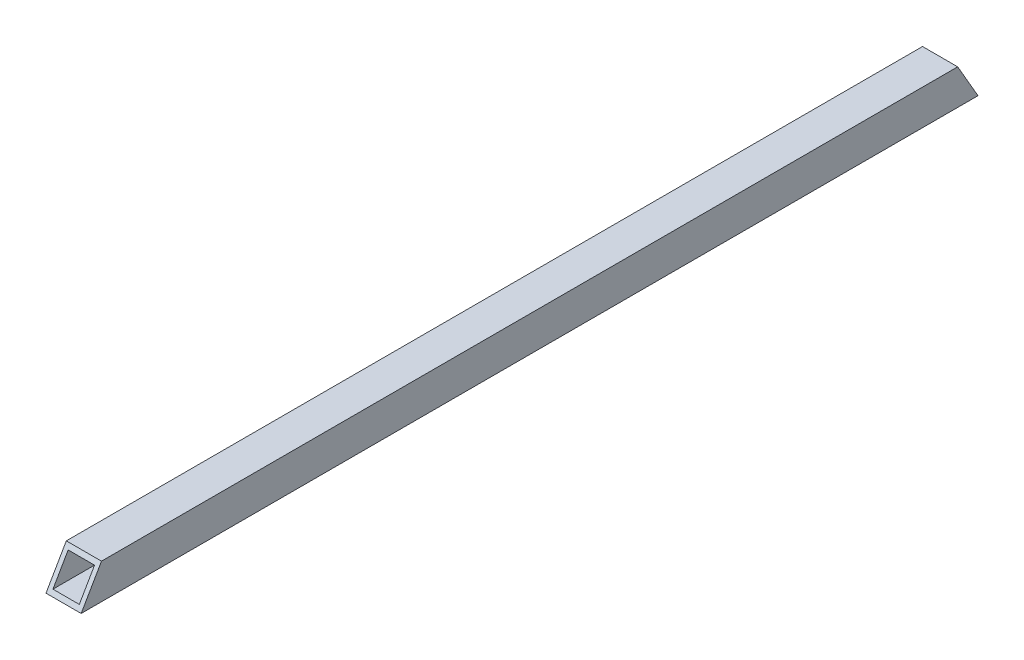
ISO-10303-21;
HEADER;
FILE_DESCRIPTION(('STEP AP214'),'2;1');
FILE_NAME('part.step','',(''),(''),'','','');
FILE_SCHEMA(('AUTOMOTIVE_DESIGN { 1 0 10303 214 1 1 1 1 }'));
ENDSEC;
DATA;
#1=APPLICATION_CONTEXT('core data for automotive mechanical design processes');
#2=APPLICATION_PROTOCOL_DEFINITION('international standard','automotive_design',2000,#1);
#3=PRODUCT_CONTEXT('',#1,'mechanical');
#4=PRODUCT('Part','Part','',(#3));
#5=PRODUCT_RELATED_PRODUCT_CATEGORY('part','',(#4));
#6=PRODUCT_DEFINITION_FORMATION('','',#4);
#7=PRODUCT_DEFINITION_CONTEXT('part definition',#1,'design');
#8=PRODUCT_DEFINITION('design','',#6,#7);
#9=PRODUCT_DEFINITION_SHAPE('','',#8);
#10=(LENGTH_UNIT() NAMED_UNIT(*) SI_UNIT(.MILLI.,.METRE.));
#11=(NAMED_UNIT(*) PLANE_ANGLE_UNIT() SI_UNIT($,.RADIAN.));
#12=(NAMED_UNIT(*) SI_UNIT($,.STERADIAN.) SOLID_ANGLE_UNIT());
#13=UNCERTAINTY_MEASURE_WITH_UNIT(LENGTH_MEASURE(1.E-05),#10,'distance_accuracy_value','');
#14=(GEOMETRIC_REPRESENTATION_CONTEXT(3) GLOBAL_UNCERTAINTY_ASSIGNED_CONTEXT((#13)) GLOBAL_UNIT_ASSIGNED_CONTEXT((#10,
#11,#12)) REPRESENTATION_CONTEXT('',''));
#15=CARTESIAN_POINT('',(0.,0.,0.));
#16=DIRECTION('',(0.,0.,1.));
#17=DIRECTION('',(1.,0.,0.));
#18=AXIS2_PLACEMENT_3D('',#15,#16,#17);
#19=CARTESIAN_POINT('',(-12.7,-12.7,323.85));
#20=DIRECTION('',(1.,0.,0.));
#21=DIRECTION('',(0.,0.,-1.));
#22=AXIS2_PLACEMENT_3D('',#19,#20,#21);
#23=PLANE('',#22);
#24=DIRECTION('',(0.,0.,-1.));
#25=VECTOR('',#24,1.);
#26=CARTESIAN_POINT('',(-12.7,12.7,323.85));
#27=LINE('',#26,#25);
#28=CARTESIAN_POINT('',(-12.7,12.7,309.185303162584));
#29=VERTEX_POINT('',#28);
#30=CARTESIAN_POINT('',(-12.7,12.7,-309.185303162584));
#31=VERTEX_POINT('',#30);
#32=EDGE_CURVE('E110',#29,#31,#27,.T.);
#33=ORIENTED_EDGE('',*,*,#32,.T.);
#34=DIRECTION('',(0.,-0.866025403784444,-0.49999999999999));
#35=VECTOR('',#34,1.);
#36=CARTESIAN_POINT('',(-12.7,-12.7,-323.85));
#37=LINE('',#36,#35);
#38=CARTESIAN_POINT('',(-12.7,-12.7,-323.85));
#39=VERTEX_POINT('',#38);
#40=EDGE_CURVE('E94',#31,#39,#37,.T.);
#41=ORIENTED_EDGE('',*,*,#40,.T.);
#42=DIRECTION('',(0.,0.,-1.));
#43=VECTOR('',#42,1.);
#44=CARTESIAN_POINT('',(-12.7,-12.7,323.85));
#45=LINE('',#44,#43);
#46=CARTESIAN_POINT('',(-12.7,-12.7,323.85));
#47=VERTEX_POINT('',#46);
#48=EDGE_CURVE('E39',#47,#39,#45,.T.);
#49=ORIENTED_EDGE('',*,*,#48,.F.);
#50=DIRECTION('',(0.,-0.866025403784444,0.49999999999999));
#51=VECTOR('',#50,1.);
#52=CARTESIAN_POINT('',(-12.7,-12.7,323.85));
#53=LINE('',#52,#51);
#54=EDGE_CURVE('E116',#29,#47,#53,.T.);
#55=ORIENTED_EDGE('',*,*,#54,.F.);
#56=EDGE_LOOP('',(#33,#41,#49,#55));
#57=FACE_BOUND('',#56,.T.);
#58=ADVANCED_FACE('F32',(#57),#23,.F.);
#59=CARTESIAN_POINT('',(12.7,-12.7,323.85));
#60=DIRECTION('',(0.,1.,0.));
#61=DIRECTION('',(-1.,0.,0.));
#62=AXIS2_PLACEMENT_3D('',#59,#60,#61);
#63=PLANE('',#62);
#64=ORIENTED_EDGE('',*,*,#48,.T.);
#65=DIRECTION('',(1.,0.,0.));
#66=VECTOR('',#65,1.);
#67=CARTESIAN_POINT('',(12.7,-12.7,-323.85));
#68=LINE('',#67,#66);
#69=CARTESIAN_POINT('',(12.7,-12.7,-323.85));
#70=VERTEX_POINT('',#69);
#71=EDGE_CURVE('E100',#39,#70,#68,.T.);
#72=ORIENTED_EDGE('',*,*,#71,.T.);
#73=DIRECTION('',(0.,0.,-1.));
#74=VECTOR('',#73,1.);
#75=CARTESIAN_POINT('',(12.7,-12.7,323.85));
#76=LINE('',#75,#74);
#77=CARTESIAN_POINT('',(12.7,-12.7,323.85));
#78=VERTEX_POINT('',#77);
#79=EDGE_CURVE('E119',#78,#70,#76,.T.);
#80=ORIENTED_EDGE('',*,*,#79,.F.);
#81=DIRECTION('',(1.,0.,0.));
#82=VECTOR('',#81,1.);
#83=CARTESIAN_POINT('',(12.7,-12.7,323.85));
#84=LINE('',#83,#82);
#85=EDGE_CURVE('E117',#47,#78,#84,.T.);
#86=ORIENTED_EDGE('',*,*,#85,.F.);
#87=EDGE_LOOP('',(#64,#72,#80,#86));
#88=FACE_BOUND('',#87,.T.);
#89=ADVANCED_FACE('F128',(#88),#63,.F.);
#90=CARTESIAN_POINT('',(12.7,-12.7,323.85));
#91=DIRECTION('',(-1.,0.,0.));
#92=DIRECTION('',(0.,0.,1.));
#93=AXIS2_PLACEMENT_3D('',#90,#91,#92);
#94=PLANE('',#93);
#95=ORIENTED_EDGE('',*,*,#79,.T.);
#96=DIRECTION('',(0.,0.866025403784444,0.49999999999999));
#97=VECTOR('',#96,1.);
#98=CARTESIAN_POINT('',(12.7,12.7,-309.185303162584));
#99=LINE('',#98,#97);
#100=CARTESIAN_POINT('',(12.7,12.7,-309.185303162584));
#101=VERTEX_POINT('',#100);
#102=EDGE_CURVE('E113',#70,#101,#99,.T.);
#103=ORIENTED_EDGE('',*,*,#102,.T.);
#104=DIRECTION('',(0.,0.,-1.));
#105=VECTOR('',#104,1.);
#106=CARTESIAN_POINT('',(12.7,12.7,323.85));
#107=LINE('',#106,#105);
#108=CARTESIAN_POINT('',(12.7,12.7,309.185303162584));
#109=VERTEX_POINT('',#108);
#110=EDGE_CURVE('E112',#109,#101,#107,.T.);
#111=ORIENTED_EDGE('',*,*,#110,.F.);
#112=DIRECTION('',(0.,0.866025403784444,-0.49999999999999));
#113=VECTOR('',#112,1.);
#114=CARTESIAN_POINT('',(12.7,12.7,309.185303162584));
#115=LINE('',#114,#113);
#116=EDGE_CURVE('E54',#78,#109,#115,.T.);
#117=ORIENTED_EDGE('',*,*,#116,.F.);
#118=EDGE_LOOP('',(#95,#103,#111,#117));
#119=FACE_BOUND('',#118,.T.);
#120=ADVANCED_FACE('F132',(#119),#94,.F.);
#121=CARTESIAN_POINT('',(12.7,12.7,323.85));
#122=DIRECTION('',(0.,-1.,0.));
#123=DIRECTION('',(1.,0.,0.));
#124=AXIS2_PLACEMENT_3D('',#121,#122,#123);
#125=PLANE('',#124);
#126=ORIENTED_EDGE('',*,*,#110,.T.);
#127=DIRECTION('',(-1.,0.,0.));
#128=VECTOR('',#127,1.);
#129=CARTESIAN_POINT('',(-12.7,12.7,-309.185303162584));
#130=LINE('',#129,#128);
#131=EDGE_CURVE('E97',#101,#31,#130,.T.);
#132=ORIENTED_EDGE('',*,*,#131,.T.);
#133=ORIENTED_EDGE('',*,*,#32,.F.);
#134=DIRECTION('',(-1.,0.,0.));
#135=VECTOR('',#134,1.);
#136=CARTESIAN_POINT('',(-12.7,12.7,309.185303162584));
#137=LINE('',#136,#135);
#138=EDGE_CURVE('E133',#109,#29,#137,.T.);
#139=ORIENTED_EDGE('',*,*,#138,.F.);
#140=EDGE_LOOP('',(#126,#132,#133,#139));
#141=FACE_BOUND('',#140,.T.);
#142=ADVANCED_FACE('F109',(#141),#125,.F.);
#143=CARTESIAN_POINT('',(-9.525,-9.525,323.85));
#144=DIRECTION('',(1.,0.,0.));
#145=DIRECTION('',(0.,0.,-1.));
#146=AXIS2_PLACEMENT_3D('',#143,#144,#145);
#147=PLANE('',#146);
#148=DIRECTION('',(0.,-0.866025403784444,-0.49999999999999));
#149=VECTOR('',#148,1.);
#150=CARTESIAN_POINT('',(-9.525,270.143577015587,-160.550184671498));
#151=LINE('',#150,#149);
#152=CARTESIAN_POINT('',(-9.525,9.525,-311.018390267261));
#153=VERTEX_POINT('',#152);
#154=CARTESIAN_POINT('',(-9.525,-9.525,-322.016912895323));
#155=VERTEX_POINT('',#154);
#156=EDGE_CURVE('E160',#153,#155,#151,.T.);
#157=ORIENTED_EDGE('',*,*,#156,.F.);
#158=DIRECTION('',(0.,0.,-1.));
#159=VECTOR('',#158,1.);
#160=CARTESIAN_POINT('',(-9.525,9.525,323.85));
#161=LINE('',#160,#159);
#162=CARTESIAN_POINT('',(-9.525,9.525,311.018390267261));
#163=VERTEX_POINT('',#162);
#164=EDGE_CURVE('E145',#163,#153,#161,.T.);
#165=ORIENTED_EDGE('',*,*,#164,.F.);
#166=DIRECTION('',(0.,0.866025403784444,-0.49999999999999));
#167=VECTOR('',#166,1.);
#168=CARTESIAN_POINT('',(-9.525,-10.3187499999999,322.475184671492));
#169=LINE('',#168,#167);
#170=CARTESIAN_POINT('',(-9.525,-9.525,322.016912895323));
#171=VERTEX_POINT('',#170);
#172=EDGE_CURVE('E143',#171,#163,#169,.T.);
#173=ORIENTED_EDGE('',*,*,#172,.F.);
#174=DIRECTION('',(0.,0.,-1.));
#175=VECTOR('',#174,1.);
#176=CARTESIAN_POINT('',(-9.525,-9.525,323.85));
#177=LINE('',#176,#175);
#178=EDGE_CURVE('E121',#171,#155,#177,.T.);
#179=ORIENTED_EDGE('',*,*,#178,.T.);
#180=EDGE_LOOP('',(#157,#165,#173,#179));
#181=FACE_BOUND('',#180,.T.);
#182=ADVANCED_FACE('F158',(#181),#147,.T.);
#183=CARTESIAN_POINT('',(9.525,-9.525,323.85));
#184=DIRECTION('',(0.,1.,0.));
#185=DIRECTION('',(0.,0.,1.));
#186=AXIS2_PLACEMENT_3D('',#183,#184,#185);
#187=PLANE('',#186);
#188=DIRECTION('',(1.,0.,0.));
#189=VECTOR('',#188,1.);
#190=CARTESIAN_POINT('',(9.525,-9.525,-322.016912895323));
#191=LINE('',#190,#189);
#192=CARTESIAN_POINT('',(9.525,-9.52499999999995,-322.016912895323));
#193=VERTEX_POINT('',#192);
#194=EDGE_CURVE('E166',#155,#193,#191,.T.);
#195=ORIENTED_EDGE('',*,*,#194,.F.);
#196=ORIENTED_EDGE('',*,*,#178,.F.);
#197=DIRECTION('',(-1.,0.,0.));
#198=VECTOR('',#197,1.);
#199=CARTESIAN_POINT('',(9.525,-9.525,322.016912895323));
#200=LINE('',#199,#198);
#201=CARTESIAN_POINT('',(9.525,-9.525,322.016912895323));
#202=VERTEX_POINT('',#201);
#203=EDGE_CURVE('E141',#202,#171,#200,.T.);
#204=ORIENTED_EDGE('',*,*,#203,.F.);
#205=DIRECTION('',(0.,0.,-1.));
#206=VECTOR('',#205,1.);
#207=CARTESIAN_POINT('',(9.525,-9.525,323.85));
#208=LINE('',#207,#206);
#209=EDGE_CURVE('E151',#202,#193,#208,.T.);
#210=ORIENTED_EDGE('',*,*,#209,.T.);
#211=EDGE_LOOP('',(#195,#196,#204,#210));
#212=FACE_BOUND('',#211,.T.);
#213=ADVANCED_FACE('F164',(#212),#187,.T.);
#214=CARTESIAN_POINT('',(9.525,-9.525,323.85));
#215=DIRECTION('',(-1.,0.,0.));
#216=DIRECTION('',(0.,0.,1.));
#217=AXIS2_PLACEMENT_3D('',#214,#215,#216);
#218=PLANE('',#217);
#219=DIRECTION('',(0.,0.866025403784444,0.49999999999999));
#220=VECTOR('',#219,1.);
#221=CARTESIAN_POINT('',(9.525,270.143577015587,-160.550184671498));
#222=LINE('',#221,#220);
#223=CARTESIAN_POINT('',(9.525,9.525,-311.018390267261));
#224=VERTEX_POINT('',#223);
#225=EDGE_CURVE('E46',#193,#224,#222,.T.);
#226=ORIENTED_EDGE('',*,*,#225,.F.);
#227=ORIENTED_EDGE('',*,*,#209,.F.);
#228=DIRECTION('',(0.,-0.866025403784444,0.49999999999999));
#229=VECTOR('',#228,1.);
#230=CARTESIAN_POINT('',(9.525,-10.3187499999999,322.475184671492));
#231=LINE('',#230,#229);
#232=CARTESIAN_POINT('',(9.525,9.525,311.018390267261));
#233=VERTEX_POINT('',#232);
#234=EDGE_CURVE('E135',#233,#202,#231,.T.);
#235=ORIENTED_EDGE('',*,*,#234,.F.);
#236=DIRECTION('',(0.,0.,-1.));
#237=VECTOR('',#236,1.);
#238=CARTESIAN_POINT('',(9.525,9.525,323.85));
#239=LINE('',#238,#237);
#240=EDGE_CURVE('E148',#233,#224,#239,.T.);
#241=ORIENTED_EDGE('',*,*,#240,.T.);
#242=EDGE_LOOP('',(#226,#227,#235,#241));
#243=FACE_BOUND('',#242,.T.);
#244=ADVANCED_FACE('F179',(#243),#218,.T.);
#245=CARTESIAN_POINT('',(9.525,9.525,323.85));
#246=DIRECTION('',(0.,-1.,0.));
#247=DIRECTION('',(0.,0.,-1.));
#248=AXIS2_PLACEMENT_3D('',#245,#246,#247);
#249=PLANE('',#248);
#250=DIRECTION('',(-1.,0.,0.));
#251=VECTOR('',#250,1.);
#252=CARTESIAN_POINT('',(9.525,9.525,-311.018390267261));
#253=LINE('',#252,#251);
#254=EDGE_CURVE('E169',#224,#153,#253,.T.);
#255=ORIENTED_EDGE('',*,*,#254,.F.);
#256=ORIENTED_EDGE('',*,*,#240,.F.);
#257=DIRECTION('',(1.,0.,0.));
#258=VECTOR('',#257,1.);
#259=CARTESIAN_POINT('',(9.525,9.525,311.018390267261));
#260=LINE('',#259,#258);
#261=EDGE_CURVE('E11',#163,#233,#260,.T.);
#262=ORIENTED_EDGE('',*,*,#261,.F.);
#263=ORIENTED_EDGE('',*,*,#164,.T.);
#264=EDGE_LOOP('',(#255,#256,#262,#263));
#265=FACE_BOUND('',#264,.T.);
#266=ADVANCED_FACE('F175',(#265),#249,.T.);
#267=CARTESIAN_POINT('',(0.,137.056163507794,237.388238685972));
#268=DIRECTION('',(0.,-0.49999999999999,-0.866025403784444));
#269=DIRECTION('',(0.,0.866025403784444,-0.49999999999999));
#270=AXIS2_PLACEMENT_3D('',#267,#268,#269);
#271=PLANE('',#270);
#272=ORIENTED_EDGE('',*,*,#172,.T.);
#273=ORIENTED_EDGE('',*,*,#261,.T.);
#274=ORIENTED_EDGE('',*,*,#234,.T.);
#275=ORIENTED_EDGE('',*,*,#203,.T.);
#276=EDGE_LOOP('',(#272,#273,#274,#275));
#277=FACE_BOUND('',#276,.T.);
#278=ORIENTED_EDGE('',*,*,#54,.T.);
#279=ORIENTED_EDGE('',*,*,#85,.T.);
#280=ORIENTED_EDGE('',*,*,#116,.T.);
#281=ORIENTED_EDGE('',*,*,#138,.T.);
#282=EDGE_LOOP('',(#278,#279,#280,#281));
#283=FACE_BOUND('',#282,.T.);
#284=ADVANCED_FACE('F130',(#277,#283),#271,.F.);
#285=CARTESIAN_POINT('',(0.,137.056163507794,-237.388238685972));
#286=DIRECTION('',(0.,-0.49999999999999,0.866025403784444));
#287=DIRECTION('',(0.,0.866025403784444,0.49999999999999));
#288=AXIS2_PLACEMENT_3D('',#285,#286,#287);
#289=PLANE('',#288);
#290=ORIENTED_EDGE('',*,*,#156,.T.);
#291=ORIENTED_EDGE('',*,*,#194,.T.);
#292=ORIENTED_EDGE('',*,*,#225,.T.);
#293=ORIENTED_EDGE('',*,*,#254,.T.);
#294=EDGE_LOOP('',(#290,#291,#292,#293));
#295=FACE_BOUND('',#294,.T.);
#296=ORIENTED_EDGE('',*,*,#40,.F.);
#297=ORIENTED_EDGE('',*,*,#131,.F.);
#298=ORIENTED_EDGE('',*,*,#102,.F.);
#299=ORIENTED_EDGE('',*,*,#71,.F.);
#300=EDGE_LOOP('',(#296,#297,#298,#299));
#301=FACE_BOUND('',#300,.T.);
#302=ADVANCED_FACE('F96',(#295,#301),#289,.F.);
#303=CLOSED_SHELL('',(#58,#89,#120,#142,#182,#213,#244,#266,#284,#302));
#304=MANIFOLD_SOLID_BREP('B2',#303);
#305=ADVANCED_BREP_SHAPE_REPRESENTATION('',(#18,#304),#14);
#306=SHAPE_DEFINITION_REPRESENTATION(#9,#305);
ENDSEC;
END-ISO-10303-21;
